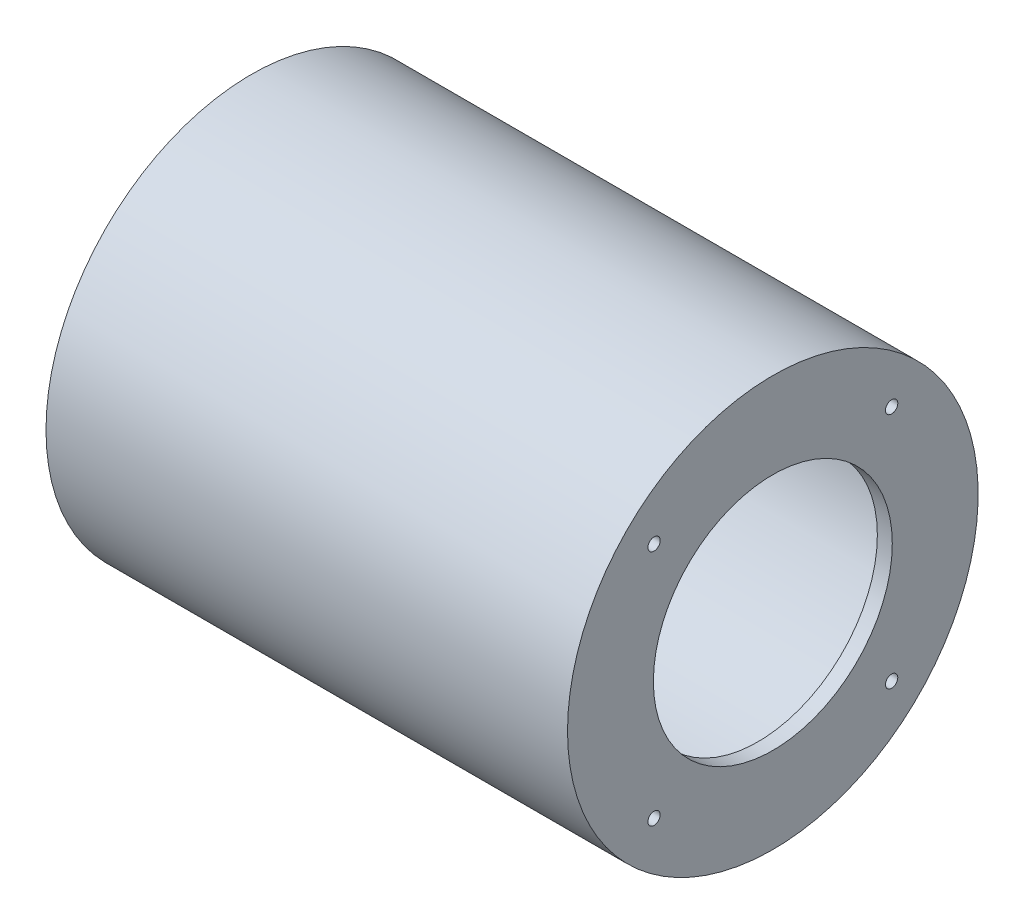
ISO-10303-21;
HEADER;
FILE_DESCRIPTION(('STEP AP214'),'2;1');
FILE_NAME('part.step','',(''),(''),'','','');
FILE_SCHEMA(('AUTOMOTIVE_DESIGN { 1 0 10303 214 1 1 1 1 }'));
ENDSEC;
DATA;
#1=APPLICATION_CONTEXT('core data for automotive mechanical design processes');
#2=APPLICATION_PROTOCOL_DEFINITION('international standard','automotive_design',2000,#1);
#3=PRODUCT_CONTEXT('',#1,'mechanical');
#4=PRODUCT('Part','Part','',(#3));
#5=PRODUCT_RELATED_PRODUCT_CATEGORY('part','',(#4));
#6=PRODUCT_DEFINITION_FORMATION('','',#4);
#7=PRODUCT_DEFINITION_CONTEXT('part definition',#1,'design');
#8=PRODUCT_DEFINITION('design','',#6,#7);
#9=PRODUCT_DEFINITION_SHAPE('','',#8);
#10=(LENGTH_UNIT() NAMED_UNIT(*) SI_UNIT(.MILLI.,.METRE.));
#11=(NAMED_UNIT(*) PLANE_ANGLE_UNIT() SI_UNIT($,.RADIAN.));
#12=(NAMED_UNIT(*) SI_UNIT($,.STERADIAN.) SOLID_ANGLE_UNIT());
#13=UNCERTAINTY_MEASURE_WITH_UNIT(LENGTH_MEASURE(1.E-05),#10,'distance_accuracy_value','');
#14=(GEOMETRIC_REPRESENTATION_CONTEXT(3) GLOBAL_UNCERTAINTY_ASSIGNED_CONTEXT((#13)) GLOBAL_UNIT_ASSIGNED_CONTEXT((#10,
#11,#12)) REPRESENTATION_CONTEXT('',''));
#15=CARTESIAN_POINT('',(0.,0.,0.));
#16=DIRECTION('',(0.,0.,1.));
#17=DIRECTION('',(1.,0.,0.));
#18=AXIS2_PLACEMENT_3D('',#15,#16,#17);
#19=CARTESIAN_POINT('',(-126.,55.,0.));
#20=DIRECTION('',(1.,0.,0.));
#21=DIRECTION('',(0.,0.,-1.));
#22=AXIS2_PLACEMENT_3D('',#19,#20,#21);
#23=PLANE('',#22);
#24=CARTESIAN_POINT('',(-126.,52.,0.));
#25=DIRECTION('',(1.,0.,0.));
#26=DIRECTION('',(0.,0.,-1.));
#27=AXIS2_PLACEMENT_3D('',#24,#25,#26);
#28=CIRCLE('',#27,1.55);
#29=CARTESIAN_POINT('',(-126.,52.,-1.55));
#30=VERTEX_POINT('',#29);
#31=EDGE_CURVE('E99',#30,#30,#28,.T.);
#32=ORIENTED_EDGE('',*,*,#31,.T.);
#33=EDGE_LOOP('',(#32));
#34=FACE_BOUND('',#33,.T.);
#35=CARTESIAN_POINT('',(-126.,0.,52.));
#36=DIRECTION('',(1.,0.,0.));
#37=DIRECTION('',(0.,0.,-1.));
#38=AXIS2_PLACEMENT_3D('',#35,#36,#37);
#39=CIRCLE('',#38,1.55);
#40=CARTESIAN_POINT('',(-126.,0.,50.45));
#41=VERTEX_POINT('',#40);
#42=EDGE_CURVE('E93',#41,#41,#39,.T.);
#43=ORIENTED_EDGE('',*,*,#42,.T.);
#44=EDGE_LOOP('',(#43));
#45=FACE_BOUND('',#44,.T.);
#46=CARTESIAN_POINT('',(-126.,-52.,0.));
#47=DIRECTION('',(1.,0.,0.));
#48=DIRECTION('',(0.,0.,-1.));
#49=AXIS2_PLACEMENT_3D('',#46,#47,#48);
#50=CIRCLE('',#49,1.55);
#51=CARTESIAN_POINT('',(-126.,-52.,-1.54999999999999));
#52=VERTEX_POINT('',#51);
#53=EDGE_CURVE('E87',#52,#52,#50,.T.);
#54=ORIENTED_EDGE('',*,*,#53,.T.);
#55=EDGE_LOOP('',(#54));
#56=FACE_BOUND('',#55,.T.);
#57=CARTESIAN_POINT('',(-126.,0.,-52.));
#58=DIRECTION('',(1.,0.,0.));
#59=DIRECTION('',(0.,0.,-1.));
#60=AXIS2_PLACEMENT_3D('',#57,#58,#59);
#61=CIRCLE('',#60,1.55);
#62=CARTESIAN_POINT('',(-126.,0.,-53.55));
#63=VERTEX_POINT('',#62);
#64=EDGE_CURVE('E81',#63,#63,#61,.T.);
#65=ORIENTED_EDGE('',*,*,#64,.T.);
#66=EDGE_LOOP('',(#65));
#67=FACE_BOUND('',#66,.T.);
#68=CARTESIAN_POINT('',(-126.,0.,0.));
#69=DIRECTION('',(-1.,0.,0.));
#70=DIRECTION('',(0.,0.,1.));
#71=AXIS2_PLACEMENT_3D('',#68,#69,#70);
#72=CIRCLE('',#71,49.);
#73=CARTESIAN_POINT('',(-126.,0.,49.));
#74=VERTEX_POINT('',#73);
#75=EDGE_CURVE('E10',#74,#74,#72,.T.);
#76=ORIENTED_EDGE('',*,*,#75,.F.);
#77=EDGE_LOOP('',(#76));
#78=FACE_BOUND('',#77,.T.);
#79=CARTESIAN_POINT('',(-126.,0.,0.));
#80=DIRECTION('',(-1.,0.,0.));
#81=DIRECTION('',(0.,0.,1.));
#82=AXIS2_PLACEMENT_3D('',#79,#80,#81);
#83=CIRCLE('',#82,55.);
#84=CARTESIAN_POINT('',(-126.,0.,55.));
#85=VERTEX_POINT('',#84);
#86=EDGE_CURVE('E53',#85,#85,#83,.T.);
#87=ORIENTED_EDGE('',*,*,#86,.T.);
#88=EDGE_LOOP('',(#87));
#89=FACE_BOUND('',#88,.T.);
#90=ADVANCED_FACE('F31',(#34,#45,#56,#67,#78,#89),#23,.F.);
#91=CARTESIAN_POINT('',(-110.,0.,0.));
#92=DIRECTION('',(-1.,0.,0.));
#93=DIRECTION('',(0.,0.,1.));
#94=AXIS2_PLACEMENT_3D('',#91,#92,#93);
#95=CYLINDRICAL_SURFACE('',#94,49.);
#96=CARTESIAN_POINT('',(9.7,0.,0.));
#97=DIRECTION('',(-1.,0.,0.));
#98=DIRECTION('',(0.,0.,1.));
#99=AXIS2_PLACEMENT_3D('',#96,#97,#98);
#100=CIRCLE('',#99,49.);
#101=CARTESIAN_POINT('',(9.7,0.,49.));
#102=VERTEX_POINT('',#101);
#103=EDGE_CURVE('E37',#102,#102,#100,.T.);
#104=ORIENTED_EDGE('',*,*,#103,.F.);
#105=EDGE_LOOP('',(#104));
#106=FACE_BOUND('',#105,.T.);
#107=ORIENTED_EDGE('',*,*,#75,.T.);
#108=EDGE_LOOP('',(#107));
#109=FACE_BOUND('',#108,.T.);
#110=ADVANCED_FACE('F117',(#106,#109),#95,.F.);
#111=CARTESIAN_POINT('',(9.7,49.,0.));
#112=DIRECTION('',(1.,0.,0.));
#113=DIRECTION('',(0.,0.,-1.));
#114=AXIS2_PLACEMENT_3D('',#111,#112,#113);
#115=PLANE('',#114);
#116=CARTESIAN_POINT('',(9.7,31.8198051533946,-31.8198051533946));
#117=DIRECTION('',(1.,0.,0.));
#118=DIRECTION('',(0.,0.,-1.));
#119=AXIS2_PLACEMENT_3D('',#116,#117,#118);
#120=CIRCLE('',#119,1.65);
#121=CARTESIAN_POINT('',(9.7,31.8198051533946,-33.4698051533946));
#122=VERTEX_POINT('',#121);
#123=EDGE_CURVE('E63',#122,#122,#120,.T.);
#124=ORIENTED_EDGE('',*,*,#123,.T.);
#125=EDGE_LOOP('',(#124));
#126=FACE_BOUND('',#125,.T.);
#127=CARTESIAN_POINT('',(9.7,-31.8198051533946,-31.8198051533946));
#128=DIRECTION('',(1.,0.,0.));
#129=DIRECTION('',(0.,0.,-1.));
#130=AXIS2_PLACEMENT_3D('',#127,#128,#129);
#131=CIRCLE('',#130,1.65);
#132=CARTESIAN_POINT('',(9.7,-31.8198051533946,-33.4698051533946));
#133=VERTEX_POINT('',#132);
#134=EDGE_CURVE('E70',#133,#133,#131,.T.);
#135=ORIENTED_EDGE('',*,*,#134,.T.);
#136=EDGE_LOOP('',(#135));
#137=FACE_BOUND('',#136,.T.);
#138=CARTESIAN_POINT('',(9.7,-31.8198051533946,31.8198051533946));
#139=DIRECTION('',(1.,0.,0.));
#140=DIRECTION('',(0.,0.,-1.));
#141=AXIS2_PLACEMENT_3D('',#138,#139,#140);
#142=CIRCLE('',#141,1.65);
#143=CARTESIAN_POINT('',(9.7,-31.8198051533946,30.1698051533946));
#144=VERTEX_POINT('',#143);
#145=EDGE_CURVE('E76',#144,#144,#142,.T.);
#146=ORIENTED_EDGE('',*,*,#145,.T.);
#147=EDGE_LOOP('',(#146));
#148=FACE_BOUND('',#147,.T.);
#149=CARTESIAN_POINT('',(9.7,31.8198051533946,31.8198051533946));
#150=DIRECTION('',(1.,0.,0.));
#151=DIRECTION('',(0.,0.,-1.));
#152=AXIS2_PLACEMENT_3D('',#149,#150,#151);
#153=CIRCLE('',#152,1.65);
#154=CARTESIAN_POINT('',(9.7,31.8198051533946,30.1698051533946));
#155=VERTEX_POINT('',#154);
#156=EDGE_CURVE('E57',#155,#155,#153,.T.);
#157=ORIENTED_EDGE('',*,*,#156,.T.);
#158=EDGE_LOOP('',(#157));
#159=FACE_BOUND('',#158,.T.);
#160=CARTESIAN_POINT('',(9.7,0.,0.));
#161=DIRECTION('',(-1.,0.,0.));
#162=DIRECTION('',(0.,0.,1.));
#163=AXIS2_PLACEMENT_3D('',#160,#161,#162);
#164=CIRCLE('',#163,32.);
#165=CARTESIAN_POINT('',(9.7,0.,32.));
#166=VERTEX_POINT('',#165);
#167=EDGE_CURVE('E41',#166,#166,#164,.T.);
#168=ORIENTED_EDGE('',*,*,#167,.F.);
#169=EDGE_LOOP('',(#168));
#170=FACE_BOUND('',#169,.T.);
#171=ORIENTED_EDGE('',*,*,#103,.T.);
#172=EDGE_LOOP('',(#171));
#173=FACE_BOUND('',#172,.T.);
#174=ADVANCED_FACE('F122',(#126,#137,#148,#159,#170,#173),#115,.F.);
#175=CARTESIAN_POINT('',(-110.,0.,0.));
#176=DIRECTION('',(-1.,0.,0.));
#177=DIRECTION('',(0.,0.,1.));
#178=AXIS2_PLACEMENT_3D('',#175,#176,#177);
#179=CYLINDRICAL_SURFACE('',#178,32.);
#180=CARTESIAN_POINT('',(13.7,0.,0.));
#181=DIRECTION('',(-1.,0.,0.));
#182=DIRECTION('',(0.,0.,1.));
#183=AXIS2_PLACEMENT_3D('',#180,#181,#182);
#184=CIRCLE('',#183,32.);
#185=CARTESIAN_POINT('',(13.7,0.,32.));
#186=VERTEX_POINT('',#185);
#187=EDGE_CURVE('E45',#186,#186,#184,.T.);
#188=ORIENTED_EDGE('',*,*,#187,.F.);
#189=EDGE_LOOP('',(#188));
#190=FACE_BOUND('',#189,.T.);
#191=ORIENTED_EDGE('',*,*,#167,.T.);
#192=EDGE_LOOP('',(#191));
#193=FACE_BOUND('',#192,.T.);
#194=ADVANCED_FACE('F145',(#190,#193),#179,.F.);
#195=CARTESIAN_POINT('',(13.7,32.,0.));
#196=DIRECTION('',(-1.,0.,0.));
#197=DIRECTION('',(0.,0.,1.));
#198=AXIS2_PLACEMENT_3D('',#195,#196,#197);
#199=PLANE('',#198);
#200=CARTESIAN_POINT('',(13.7,31.8198051533946,-31.8198051533946));
#201=DIRECTION('',(1.,0.,0.));
#202=DIRECTION('',(0.,0.,-1.));
#203=AXIS2_PLACEMENT_3D('',#200,#201,#202);
#204=CIRCLE('',#203,1.65);
#205=CARTESIAN_POINT('',(13.7,31.8198051533946,-33.4698051533946));
#206=VERTEX_POINT('',#205);
#207=EDGE_CURVE('E66',#206,#206,#204,.T.);
#208=ORIENTED_EDGE('',*,*,#207,.F.);
#209=EDGE_LOOP('',(#208));
#210=FACE_BOUND('',#209,.T.);
#211=CARTESIAN_POINT('',(13.7,-31.8198051533946,-31.8198051533946));
#212=DIRECTION('',(1.,0.,0.));
#213=DIRECTION('',(0.,0.,-1.));
#214=AXIS2_PLACEMENT_3D('',#211,#212,#213);
#215=CIRCLE('',#214,1.65);
#216=CARTESIAN_POINT('',(13.7,-31.8198051533946,-33.4698051533946));
#217=VERTEX_POINT('',#216);
#218=EDGE_CURVE('E73',#217,#217,#215,.T.);
#219=ORIENTED_EDGE('',*,*,#218,.F.);
#220=EDGE_LOOP('',(#219));
#221=FACE_BOUND('',#220,.T.);
#222=CARTESIAN_POINT('',(13.7,-31.8198051533946,31.8198051533946));
#223=DIRECTION('',(1.,0.,0.));
#224=DIRECTION('',(0.,0.,-1.));
#225=AXIS2_PLACEMENT_3D('',#222,#223,#224);
#226=CIRCLE('',#225,1.65);
#227=CARTESIAN_POINT('',(13.7,-31.8198051533946,30.1698051533946));
#228=VERTEX_POINT('',#227);
#229=EDGE_CURVE('E60',#228,#228,#226,.T.);
#230=ORIENTED_EDGE('',*,*,#229,.F.);
#231=EDGE_LOOP('',(#230));
#232=FACE_BOUND('',#231,.T.);
#233=CARTESIAN_POINT('',(13.7,31.8198051533946,31.8198051533946));
#234=DIRECTION('',(1.,0.,0.));
#235=DIRECTION('',(0.,0.,-1.));
#236=AXIS2_PLACEMENT_3D('',#233,#234,#235);
#237=CIRCLE('',#236,1.65);
#238=CARTESIAN_POINT('',(13.7,31.8198051533946,30.1698051533946));
#239=VERTEX_POINT('',#238);
#240=EDGE_CURVE('E56',#239,#239,#237,.T.);
#241=ORIENTED_EDGE('',*,*,#240,.F.);
#242=EDGE_LOOP('',(#241));
#243=FACE_BOUND('',#242,.T.);
#244=CARTESIAN_POINT('',(13.7,0.,0.));
#245=DIRECTION('',(-1.,0.,0.));
#246=DIRECTION('',(0.,0.,1.));
#247=AXIS2_PLACEMENT_3D('',#244,#245,#246);
#248=CIRCLE('',#247,55.);
#249=CARTESIAN_POINT('',(13.7,0.,55.));
#250=VERTEX_POINT('',#249);
#251=EDGE_CURVE('E50',#250,#250,#248,.T.);
#252=ORIENTED_EDGE('',*,*,#251,.F.);
#253=EDGE_LOOP('',(#252));
#254=FACE_BOUND('',#253,.T.);
#255=ORIENTED_EDGE('',*,*,#187,.T.);
#256=EDGE_LOOP('',(#255));
#257=FACE_BOUND('',#256,.T.);
#258=ADVANCED_FACE('F139',(#210,#221,#232,#243,#254,#257),#199,.F.);
#259=CARTESIAN_POINT('',(-110.,0.,0.));
#260=DIRECTION('',(-1.,0.,0.));
#261=DIRECTION('',(0.,0.,1.));
#262=AXIS2_PLACEMENT_3D('',#259,#260,#261);
#263=CYLINDRICAL_SURFACE('',#262,55.);
#264=ORIENTED_EDGE('',*,*,#86,.F.);
#265=EDGE_LOOP('',(#264));
#266=FACE_BOUND('',#265,.T.);
#267=ORIENTED_EDGE('',*,*,#251,.T.);
#268=EDGE_LOOP('',(#267));
#269=FACE_BOUND('',#268,.T.);
#270=ADVANCED_FACE('F135',(#266,#269),#263,.T.);
#271=CARTESIAN_POINT('',(13.7,31.8198051533946,31.8198051533946));
#272=DIRECTION('',(-1.,0.,0.));
#273=DIRECTION('',(0.,0.,1.));
#274=AXIS2_PLACEMENT_3D('',#271,#272,#273);
#275=CYLINDRICAL_SURFACE('',#274,1.65);
#276=ORIENTED_EDGE('',*,*,#240,.T.);
#277=EDGE_LOOP('',(#276));
#278=FACE_BOUND('',#277,.T.);
#279=ORIENTED_EDGE('',*,*,#156,.F.);
#280=EDGE_LOOP('',(#279));
#281=FACE_BOUND('',#280,.T.);
#282=ADVANCED_FACE('F138',(#278,#281),#275,.F.);
#283=CARTESIAN_POINT('',(13.7,-31.8198051533946,31.8198051533946));
#284=DIRECTION('',(-1.,0.,0.));
#285=DIRECTION('',(0.,0.,1.));
#286=AXIS2_PLACEMENT_3D('',#283,#284,#285);
#287=CYLINDRICAL_SURFACE('',#286,1.65);
#288=ORIENTED_EDGE('',*,*,#229,.T.);
#289=EDGE_LOOP('',(#288));
#290=FACE_BOUND('',#289,.T.);
#291=ORIENTED_EDGE('',*,*,#145,.F.);
#292=EDGE_LOOP('',(#291));
#293=FACE_BOUND('',#292,.T.);
#294=ADVANCED_FACE('F164',(#290,#293),#287,.F.);
#295=CARTESIAN_POINT('',(13.7,-31.8198051533946,-31.8198051533946));
#296=DIRECTION('',(-1.,0.,0.));
#297=DIRECTION('',(0.,0.,1.));
#298=AXIS2_PLACEMENT_3D('',#295,#296,#297);
#299=CYLINDRICAL_SURFACE('',#298,1.65);
#300=ORIENTED_EDGE('',*,*,#218,.T.);
#301=EDGE_LOOP('',(#300));
#302=FACE_BOUND('',#301,.T.);
#303=ORIENTED_EDGE('',*,*,#134,.F.);
#304=EDGE_LOOP('',(#303));
#305=FACE_BOUND('',#304,.T.);
#306=ADVANCED_FACE('F170',(#302,#305),#299,.F.);
#307=CARTESIAN_POINT('',(13.7,31.8198051533946,-31.8198051533946));
#308=DIRECTION('',(-1.,0.,0.));
#309=DIRECTION('',(0.,0.,1.));
#310=AXIS2_PLACEMENT_3D('',#307,#308,#309);
#311=CYLINDRICAL_SURFACE('',#310,1.65);
#312=ORIENTED_EDGE('',*,*,#207,.T.);
#313=EDGE_LOOP('',(#312));
#314=FACE_BOUND('',#313,.T.);
#315=ORIENTED_EDGE('',*,*,#123,.F.);
#316=EDGE_LOOP('',(#315));
#317=FACE_BOUND('',#316,.T.);
#318=ADVANCED_FACE('F166',(#314,#317),#311,.F.);
#319=CARTESIAN_POINT('',(-120.,0.,-52.));
#320=DIRECTION('',(-1.,0.,0.));
#321=DIRECTION('',(0.,0.,1.));
#322=AXIS2_PLACEMENT_3D('',#319,#320,#321);
#323=CYLINDRICAL_SURFACE('',#322,1.55);
#324=CARTESIAN_POINT('',(-120.,0.,-52.));
#325=DIRECTION('',(1.,0.,0.));
#326=DIRECTION('',(0.,0.,-1.));
#327=AXIS2_PLACEMENT_3D('',#324,#325,#326);
#328=CIRCLE('',#327,1.55);
#329=CARTESIAN_POINT('',(-120.,0.,-53.55));
#330=VERTEX_POINT('',#329);
#331=EDGE_CURVE('E84',#330,#330,#328,.T.);
#332=ORIENTED_EDGE('',*,*,#331,.T.);
#333=EDGE_LOOP('',(#332));
#334=FACE_BOUND('',#333,.T.);
#335=ORIENTED_EDGE('',*,*,#64,.F.);
#336=EDGE_LOOP('',(#335));
#337=FACE_BOUND('',#336,.T.);
#338=ADVANCED_FACE('F169',(#334,#337),#323,.F.);
#339=CARTESIAN_POINT('',(-120.,0.,-52.));
#340=DIRECTION('',(1.,0.,0.));
#341=DIRECTION('',(0.,0.,-1.));
#342=AXIS2_PLACEMENT_3D('',#339,#340,#341);
#343=PLANE('',#342);
#344=ORIENTED_EDGE('',*,*,#331,.F.);
#345=EDGE_LOOP('',(#344));
#346=FACE_BOUND('',#345,.T.);
#347=ADVANCED_FACE('F180',(#346),#343,.F.);
#348=CARTESIAN_POINT('',(-120.,-52.,0.));
#349=DIRECTION('',(-1.,0.,0.));
#350=DIRECTION('',(0.,0.,1.));
#351=AXIS2_PLACEMENT_3D('',#348,#349,#350);
#352=CYLINDRICAL_SURFACE('',#351,1.55);
#353=CARTESIAN_POINT('',(-120.,-52.,0.));
#354=DIRECTION('',(1.,0.,0.));
#355=DIRECTION('',(0.,0.,-1.));
#356=AXIS2_PLACEMENT_3D('',#353,#354,#355);
#357=CIRCLE('',#356,1.55);
#358=CARTESIAN_POINT('',(-120.,-52.,-1.54999999999999));
#359=VERTEX_POINT('',#358);
#360=EDGE_CURVE('E90',#359,#359,#357,.T.);
#361=ORIENTED_EDGE('',*,*,#360,.T.);
#362=EDGE_LOOP('',(#361));
#363=FACE_BOUND('',#362,.T.);
#364=ORIENTED_EDGE('',*,*,#53,.F.);
#365=EDGE_LOOP('',(#364));
#366=FACE_BOUND('',#365,.T.);
#367=ADVANCED_FACE('F184',(#363,#366),#352,.F.);
#368=CARTESIAN_POINT('',(-120.,-52.,0.));
#369=DIRECTION('',(1.,0.,0.));
#370=DIRECTION('',(0.,0.,-1.));
#371=AXIS2_PLACEMENT_3D('',#368,#369,#370);
#372=PLANE('',#371);
#373=ORIENTED_EDGE('',*,*,#360,.F.);
#374=EDGE_LOOP('',(#373));
#375=FACE_BOUND('',#374,.T.);
#376=ADVANCED_FACE('F188',(#375),#372,.F.);
#377=CARTESIAN_POINT('',(-120.,0.,52.));
#378=DIRECTION('',(-1.,0.,0.));
#379=DIRECTION('',(0.,0.,1.));
#380=AXIS2_PLACEMENT_3D('',#377,#378,#379);
#381=CYLINDRICAL_SURFACE('',#380,1.55);
#382=CARTESIAN_POINT('',(-120.,0.,52.));
#383=DIRECTION('',(1.,0.,0.));
#384=DIRECTION('',(0.,0.,-1.));
#385=AXIS2_PLACEMENT_3D('',#382,#383,#384);
#386=CIRCLE('',#385,1.55);
#387=CARTESIAN_POINT('',(-120.,0.,50.45));
#388=VERTEX_POINT('',#387);
#389=EDGE_CURVE('E96',#388,#388,#386,.T.);
#390=ORIENTED_EDGE('',*,*,#389,.T.);
#391=EDGE_LOOP('',(#390));
#392=FACE_BOUND('',#391,.T.);
#393=ORIENTED_EDGE('',*,*,#42,.F.);
#394=EDGE_LOOP('',(#393));
#395=FACE_BOUND('',#394,.T.);
#396=ADVANCED_FACE('F192',(#392,#395),#381,.F.);
#397=CARTESIAN_POINT('',(-120.,0.,52.));
#398=DIRECTION('',(1.,0.,0.));
#399=DIRECTION('',(0.,0.,-1.));
#400=AXIS2_PLACEMENT_3D('',#397,#398,#399);
#401=PLANE('',#400);
#402=ORIENTED_EDGE('',*,*,#389,.F.);
#403=EDGE_LOOP('',(#402));
#404=FACE_BOUND('',#403,.T.);
#405=ADVANCED_FACE('F114',(#404),#401,.F.);
#406=CARTESIAN_POINT('',(-120.,52.,0.));
#407=DIRECTION('',(-1.,0.,0.));
#408=DIRECTION('',(0.,0.,1.));
#409=AXIS2_PLACEMENT_3D('',#406,#407,#408);
#410=CYLINDRICAL_SURFACE('',#409,1.55);
#411=CARTESIAN_POINT('',(-120.,52.,0.));
#412=DIRECTION('',(1.,0.,0.));
#413=DIRECTION('',(0.,0.,-1.));
#414=AXIS2_PLACEMENT_3D('',#411,#412,#413);
#415=CIRCLE('',#414,1.55);
#416=CARTESIAN_POINT('',(-120.,52.,-1.55));
#417=VERTEX_POINT('',#416);
#418=EDGE_CURVE('E67',#417,#417,#415,.T.);
#419=ORIENTED_EDGE('',*,*,#418,.T.);
#420=EDGE_LOOP('',(#419));
#421=FACE_BOUND('',#420,.T.);
#422=ORIENTED_EDGE('',*,*,#31,.F.);
#423=EDGE_LOOP('',(#422));
#424=FACE_BOUND('',#423,.T.);
#425=ADVANCED_FACE('F105',(#421,#424),#410,.F.);
#426=CARTESIAN_POINT('',(-120.,52.,0.));
#427=DIRECTION('',(1.,0.,0.));
#428=DIRECTION('',(0.,0.,-1.));
#429=AXIS2_PLACEMENT_3D('',#426,#427,#428);
#430=PLANE('',#429);
#431=ORIENTED_EDGE('',*,*,#418,.F.);
#432=EDGE_LOOP('',(#431));
#433=FACE_BOUND('',#432,.T.);
#434=ADVANCED_FACE('F108',(#433),#430,.F.);
#435=CLOSED_SHELL('',(#90,#110,#174,#194,#258,#270,#282,#294,#306,#318,#338,#347,#367,#376,#396,
#405,#425,#434));
#436=MANIFOLD_SOLID_BREP('B2',#435);
#437=ADVANCED_BREP_SHAPE_REPRESENTATION('',(#18,#436),#14);
#438=SHAPE_DEFINITION_REPRESENTATION(#9,#437);
ENDSEC;
END-ISO-10303-21;
